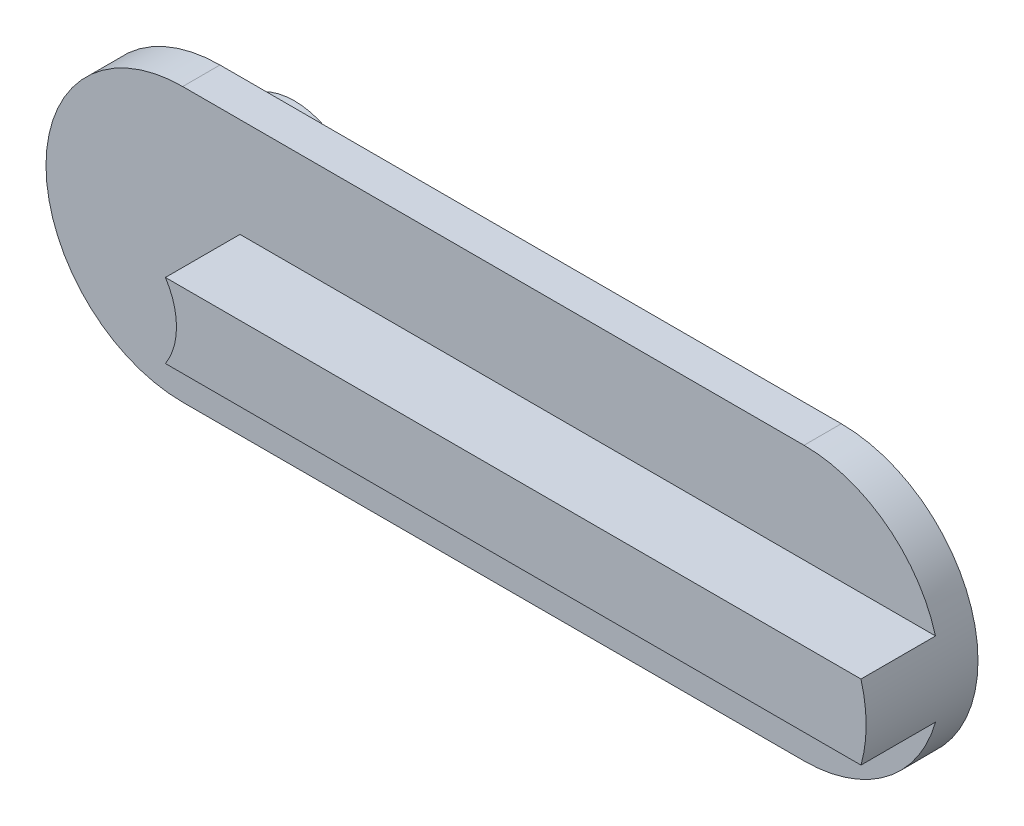
ISO-10303-21;
HEADER;
FILE_DESCRIPTION(('STEP AP214'),'2;1');
FILE_NAME('part.step','',(''),(''),'','','');
FILE_SCHEMA(('AUTOMOTIVE_DESIGN { 1 0 10303 214 1 1 1 1 }'));
ENDSEC;
DATA;
#1=APPLICATION_CONTEXT('core data for automotive mechanical design processes');
#2=APPLICATION_PROTOCOL_DEFINITION('international standard','automotive_design',2000,#1);
#3=PRODUCT_CONTEXT('',#1,'mechanical');
#4=PRODUCT('Part','Part','',(#3));
#5=PRODUCT_RELATED_PRODUCT_CATEGORY('part','',(#4));
#6=PRODUCT_DEFINITION_FORMATION('','',#4);
#7=PRODUCT_DEFINITION_CONTEXT('part definition',#1,'design');
#8=PRODUCT_DEFINITION('design','',#6,#7);
#9=PRODUCT_DEFINITION_SHAPE('','',#8);
#10=(LENGTH_UNIT() NAMED_UNIT(*) SI_UNIT(.MILLI.,.METRE.));
#11=(NAMED_UNIT(*) PLANE_ANGLE_UNIT() SI_UNIT($,.RADIAN.));
#12=(NAMED_UNIT(*) SI_UNIT($,.STERADIAN.) SOLID_ANGLE_UNIT());
#13=UNCERTAINTY_MEASURE_WITH_UNIT(LENGTH_MEASURE(1.E-05),#10,'distance_accuracy_value','');
#14=(GEOMETRIC_REPRESENTATION_CONTEXT(3) GLOBAL_UNCERTAINTY_ASSIGNED_CONTEXT((#13)) GLOBAL_UNIT_ASSIGNED_CONTEXT((#10,
#11,#12)) REPRESENTATION_CONTEXT('',''));
#15=CARTESIAN_POINT('',(0.,0.,0.));
#16=DIRECTION('',(0.,0.,1.));
#17=DIRECTION('',(1.,0.,0.));
#18=AXIS2_PLACEMENT_3D('',#15,#16,#17);
#19=CARTESIAN_POINT('',(-50.,0.,6.));
#20=DIRECTION('',(0.,0.,-1.));
#21=DIRECTION('',(-1.,0.,0.));
#22=AXIS2_PLACEMENT_3D('',#19,#20,#21);
#23=CYLINDRICAL_SURFACE('',#22,22.);
#24=CARTESIAN_POINT('',(-50.,0.,0.));
#25=DIRECTION('',(0.,0.,1.));
#26=DIRECTION('',(1.,0.,0.));
#27=AXIS2_PLACEMENT_3D('',#24,#25,#26);
#28=CIRCLE('',#27,22.);
#29=CARTESIAN_POINT('',(-50.,22.,0.));
#30=VERTEX_POINT('',#29);
#31=CARTESIAN_POINT('',(-50.,-22.,0.));
#32=VERTEX_POINT('',#31);
#33=EDGE_CURVE('E129',#30,#32,#28,.T.);
#34=ORIENTED_EDGE('',*,*,#33,.T.);
#35=DIRECTION('',(0.,0.,-1.));
#36=VECTOR('',#35,1.);
#37=CARTESIAN_POINT('',(-50.,-22.,6.));
#38=LINE('',#37,#36);
#39=CARTESIAN_POINT('',(-50.,-22.,6.));
#40=VERTEX_POINT('',#39);
#41=EDGE_CURVE('E47',#40,#32,#38,.T.);
#42=ORIENTED_EDGE('',*,*,#41,.F.);
#43=CARTESIAN_POINT('',(-50.,0.,6.));
#44=DIRECTION('',(0.,0.,1.));
#45=DIRECTION('',(1.,0.,0.));
#46=AXIS2_PLACEMENT_3D('',#43,#44,#45);
#47=CIRCLE('',#46,22.);
#48=CARTESIAN_POINT('',(-50.,22.,6.));
#49=VERTEX_POINT('',#48);
#50=EDGE_CURVE('E140',#49,#40,#47,.T.);
#51=ORIENTED_EDGE('',*,*,#50,.F.);
#52=DIRECTION('',(0.,0.,-1.));
#53=VECTOR('',#52,1.);
#54=CARTESIAN_POINT('',(-50.,22.,6.));
#55=LINE('',#54,#53);
#56=EDGE_CURVE('E153',#49,#30,#55,.T.);
#57=ORIENTED_EDGE('',*,*,#56,.T.);
#58=EDGE_LOOP('',(#34,#42,#51,#57));
#59=FACE_BOUND('',#58,.T.);
#60=ADVANCED_FACE('F39',(#59),#23,.T.);
#61=CARTESIAN_POINT('',(-50.,-22.,6.));
#62=DIRECTION('',(0.,1.,0.));
#63=DIRECTION('',(0.,0.,1.));
#64=AXIS2_PLACEMENT_3D('',#61,#62,#63);
#65=PLANE('',#64);
#66=DIRECTION('',(1.,0.,0.));
#67=VECTOR('',#66,1.);
#68=CARTESIAN_POINT('',(-50.,-22.,0.));
#69=LINE('',#68,#67);
#70=CARTESIAN_POINT('',(50.,-22.,0.));
#71=VERTEX_POINT('',#70);
#72=EDGE_CURVE('E134',#32,#71,#69,.T.);
#73=ORIENTED_EDGE('',*,*,#72,.T.);
#74=DIRECTION('',(0.,0.,-1.));
#75=VECTOR('',#74,1.);
#76=CARTESIAN_POINT('',(50.,-22.,6.));
#77=LINE('',#76,#75);
#78=CARTESIAN_POINT('',(50.,-22.,6.));
#79=VERTEX_POINT('',#78);
#80=EDGE_CURVE('E169',#79,#71,#77,.T.);
#81=ORIENTED_EDGE('',*,*,#80,.F.);
#82=DIRECTION('',(1.,0.,0.));
#83=VECTOR('',#82,1.);
#84=CARTESIAN_POINT('',(-50.,-22.,6.));
#85=LINE('',#84,#83);
#86=EDGE_CURVE('E144',#40,#79,#85,.T.);
#87=ORIENTED_EDGE('',*,*,#86,.F.);
#88=ORIENTED_EDGE('',*,*,#41,.T.);
#89=EDGE_LOOP('',(#73,#81,#87,#88));
#90=FACE_BOUND('',#89,.T.);
#91=ADVANCED_FACE('F176',(#90),#65,.F.);
#92=CARTESIAN_POINT('',(50.,0.,6.));
#93=DIRECTION('',(0.,0.,-1.));
#94=DIRECTION('',(-1.,0.,0.));
#95=AXIS2_PLACEMENT_3D('',#92,#93,#94);
#96=CYLINDRICAL_SURFACE('',#95,22.);
#97=CARTESIAN_POINT('',(50.,0.,0.));
#98=DIRECTION('',(0.,0.,1.));
#99=DIRECTION('',(1.,0.,0.));
#100=AXIS2_PLACEMENT_3D('',#97,#98,#99);
#101=CIRCLE('',#100,22.);
#102=CARTESIAN_POINT('',(50.,22.,0.));
#103=VERTEX_POINT('',#102);
#104=EDGE_CURVE('E157',#71,#103,#101,.T.);
#105=ORIENTED_EDGE('',*,*,#104,.T.);
#106=DIRECTION('',(0.,0.,-1.));
#107=VECTOR('',#106,1.);
#108=CARTESIAN_POINT('',(50.,22.,6.));
#109=LINE('',#108,#107);
#110=CARTESIAN_POINT('',(50.,22.,6.));
#111=VERTEX_POINT('',#110);
#112=EDGE_CURVE('E165',#111,#103,#109,.T.);
#113=ORIENTED_EDGE('',*,*,#112,.F.);
#114=CARTESIAN_POINT('',(50.,0.,6.));
#115=DIRECTION('',(0.,0.,1.));
#116=DIRECTION('',(1.,0.,0.));
#117=AXIS2_PLACEMENT_3D('',#114,#115,#116);
#118=CIRCLE('',#117,22.);
#119=CARTESIAN_POINT('',(71.1660104885167,6.,6.));
#120=VERTEX_POINT('',#119);
#121=EDGE_CURVE('E127',#120,#111,#118,.T.);
#122=ORIENTED_EDGE('',*,*,#121,.F.);
#123=DIRECTION('',(0.,0.,-1.));
#124=VECTOR('',#123,1.);
#125=CARTESIAN_POINT('',(71.1660104885167,6.,18.));
#126=LINE('',#125,#124);
#127=CARTESIAN_POINT('',(71.1660104885167,6.,18.));
#128=VERTEX_POINT('',#127);
#129=EDGE_CURVE('E107',#128,#120,#126,.T.);
#130=ORIENTED_EDGE('',*,*,#129,.F.);
#131=CARTESIAN_POINT('',(50.,0.,18.));
#132=DIRECTION('',(0.,0.,1.));
#133=DIRECTION('',(1.,0.,0.));
#134=AXIS2_PLACEMENT_3D('',#131,#132,#133);
#135=CIRCLE('',#134,22.);
#136=CARTESIAN_POINT('',(71.1660104885167,-6.00000000000002,18.));
#137=VERTEX_POINT('',#136);
#138=EDGE_CURVE('E114',#137,#128,#135,.T.);
#139=ORIENTED_EDGE('',*,*,#138,.F.);
#140=DIRECTION('',(0.,0.,-1.));
#141=VECTOR('',#140,1.);
#142=CARTESIAN_POINT('',(71.1660104885167,-6.00000000000002,18.));
#143=LINE('',#142,#141);
#144=CARTESIAN_POINT('',(71.1660104885167,-6.00000000000002,6.));
#145=VERTEX_POINT('',#144);
#146=EDGE_CURVE('E192',#137,#145,#143,.T.);
#147=ORIENTED_EDGE('',*,*,#146,.T.);
#148=EDGE_CURVE('E148',#79,#145,#118,.T.);
#149=ORIENTED_EDGE('',*,*,#148,.F.);
#150=ORIENTED_EDGE('',*,*,#80,.T.);
#151=EDGE_LOOP('',(#105,#113,#122,#130,#139,#147,#149,#150));
#152=FACE_BOUND('',#151,.T.);
#153=ADVANCED_FACE('F125',(#152),#96,.T.);
#154=CARTESIAN_POINT('',(-50.,22.,6.));
#155=DIRECTION('',(0.,-1.,0.));
#156=DIRECTION('',(0.,0.,-1.));
#157=AXIS2_PLACEMENT_3D('',#154,#155,#156);
#158=PLANE('',#157);
#159=DIRECTION('',(-1.,0.,0.));
#160=VECTOR('',#159,1.);
#161=CARTESIAN_POINT('',(-50.,22.,0.));
#162=LINE('',#161,#160);
#163=EDGE_CURVE('E145',#103,#30,#162,.T.);
#164=ORIENTED_EDGE('',*,*,#163,.T.);
#165=ORIENTED_EDGE('',*,*,#56,.F.);
#166=DIRECTION('',(-1.,0.,0.));
#167=VECTOR('',#166,1.);
#168=CARTESIAN_POINT('',(-50.,22.,6.));
#169=LINE('',#168,#167);
#170=EDGE_CURVE('E151',#111,#49,#169,.T.);
#171=ORIENTED_EDGE('',*,*,#170,.F.);
#172=ORIENTED_EDGE('',*,*,#112,.T.);
#173=EDGE_LOOP('',(#164,#165,#171,#172));
#174=FACE_BOUND('',#173,.T.);
#175=ADVANCED_FACE('F189',(#174),#158,.F.);
#176=CARTESIAN_POINT('',(-50.,0.,6.));
#177=DIRECTION('',(0.,0.,1.));
#178=DIRECTION('',(1.,0.,0.));
#179=AXIS2_PLACEMENT_3D('',#176,#177,#178);
#180=PLANE('',#179);
#181=DIRECTION('',(1.,0.,0.));
#182=VECTOR('',#181,1.);
#183=CARTESIAN_POINT('',(-40.7804555427071,-6.00000000000002,6.));
#184=LINE('',#183,#182);
#185=CARTESIAN_POINT('',(-40.7804555427071,-6.00000000000002,6.));
#186=VERTEX_POINT('',#185);
#187=EDGE_CURVE('E54',#186,#145,#184,.T.);
#188=ORIENTED_EDGE('',*,*,#187,.F.);
#189=CARTESIAN_POINT('',(-50.,0.,6.));
#190=DIRECTION('',(0.,0.,-1.));
#191=DIRECTION('',(1.,0.,0.));
#192=AXIS2_PLACEMENT_3D('',#189,#190,#191);
#193=CIRCLE('',#192,11.);
#194=CARTESIAN_POINT('',(-40.7804555427071,6.,6.));
#195=VERTEX_POINT('',#194);
#196=EDGE_CURVE('E203',#195,#186,#193,.T.);
#197=ORIENTED_EDGE('',*,*,#196,.F.);
#198=DIRECTION('',(-1.,0.,0.));
#199=VECTOR('',#198,1.);
#200=CARTESIAN_POINT('',(-40.7804555427071,6.,6.));
#201=LINE('',#200,#199);
#202=EDGE_CURVE('E60',#120,#195,#201,.T.);
#203=ORIENTED_EDGE('',*,*,#202,.F.);
#204=ORIENTED_EDGE('',*,*,#121,.T.);
#205=ORIENTED_EDGE('',*,*,#170,.T.);
#206=ORIENTED_EDGE('',*,*,#50,.T.);
#207=ORIENTED_EDGE('',*,*,#86,.T.);
#208=ORIENTED_EDGE('',*,*,#148,.T.);
#209=EDGE_LOOP('',(#188,#197,#203,#204,#205,#206,#207,#208));
#210=FACE_BOUND('',#209,.T.);
#211=ADVANCED_FACE('F190',(#210),#180,.T.);
#212=CARTESIAN_POINT('',(-50.,0.,0.));
#213=DIRECTION('',(0.,0.,1.));
#214=DIRECTION('',(1.,0.,0.));
#215=AXIS2_PLACEMENT_3D('',#212,#213,#214);
#216=PLANE('',#215);
#217=CARTESIAN_POINT('',(-50.,0.,0.));
#218=DIRECTION('',(0.,0.,1.));
#219=DIRECTION('',(1.,0.,0.));
#220=AXIS2_PLACEMENT_3D('',#217,#218,#219);
#221=CIRCLE('',#220,11.);
#222=CARTESIAN_POINT('',(-39.,0.,0.));
#223=VERTEX_POINT('',#222);
#224=EDGE_CURVE('E11',#223,#223,#221,.F.);
#225=ORIENTED_EDGE('',*,*,#224,.F.);
#226=EDGE_LOOP('',(#225));
#227=FACE_BOUND('',#226,.T.);
#228=ORIENTED_EDGE('',*,*,#33,.F.);
#229=ORIENTED_EDGE('',*,*,#163,.F.);
#230=ORIENTED_EDGE('',*,*,#104,.F.);
#231=ORIENTED_EDGE('',*,*,#72,.F.);
#232=EDGE_LOOP('',(#228,#229,#230,#231));
#233=FACE_BOUND('',#232,.T.);
#234=ADVANCED_FACE('F184',(#227,#233),#216,.F.);
#235=CARTESIAN_POINT('',(-40.7804555427071,6.,18.));
#236=DIRECTION('',(0.,-1.,0.));
#237=DIRECTION('',(1.,0.,0.));
#238=AXIS2_PLACEMENT_3D('',#235,#236,#237);
#239=PLANE('',#238);
#240=ORIENTED_EDGE('',*,*,#202,.T.);
#241=DIRECTION('',(0.,0.,-1.));
#242=VECTOR('',#241,1.);
#243=CARTESIAN_POINT('',(-40.7804555427071,6.,18.));
#244=LINE('',#243,#242);
#245=CARTESIAN_POINT('',(-40.7804555427071,6.,18.));
#246=VERTEX_POINT('',#245);
#247=EDGE_CURVE('E109',#246,#195,#244,.T.);
#248=ORIENTED_EDGE('',*,*,#247,.F.);
#249=DIRECTION('',(-1.,0.,0.));
#250=VECTOR('',#249,1.);
#251=CARTESIAN_POINT('',(-40.7804555427071,6.,18.));
#252=LINE('',#251,#250);
#253=EDGE_CURVE('E103',#128,#246,#252,.T.);
#254=ORIENTED_EDGE('',*,*,#253,.F.);
#255=ORIENTED_EDGE('',*,*,#129,.T.);
#256=EDGE_LOOP('',(#240,#248,#254,#255));
#257=FACE_BOUND('',#256,.T.);
#258=ADVANCED_FACE('F105',(#257),#239,.F.);
#259=CARTESIAN_POINT('',(-50.,0.,18.));
#260=DIRECTION('',(0.,0.,-1.));
#261=DIRECTION('',(-1.,0.,0.));
#262=AXIS2_PLACEMENT_3D('',#259,#260,#261);
#263=CYLINDRICAL_SURFACE('',#262,11.);
#264=ORIENTED_EDGE('',*,*,#196,.T.);
#265=DIRECTION('',(0.,0.,-1.));
#266=VECTOR('',#265,1.);
#267=CARTESIAN_POINT('',(-40.7804555427071,-6.00000000000002,18.));
#268=LINE('',#267,#266);
#269=CARTESIAN_POINT('',(-40.7804555427071,-6.00000000000002,18.));
#270=VERTEX_POINT('',#269);
#271=EDGE_CURVE('E136',#270,#186,#268,.T.);
#272=ORIENTED_EDGE('',*,*,#271,.F.);
#273=CARTESIAN_POINT('',(-50.,0.,18.));
#274=DIRECTION('',(0.,0.,-1.));
#275=DIRECTION('',(1.,0.,0.));
#276=AXIS2_PLACEMENT_3D('',#273,#274,#275);
#277=CIRCLE('',#276,11.);
#278=EDGE_CURVE('E113',#246,#270,#277,.T.);
#279=ORIENTED_EDGE('',*,*,#278,.F.);
#280=ORIENTED_EDGE('',*,*,#247,.T.);
#281=EDGE_LOOP('',(#264,#272,#279,#280));
#282=FACE_BOUND('',#281,.T.);
#283=ADVANCED_FACE('F229',(#282),#263,.F.);
#284=CARTESIAN_POINT('',(-40.7804555427071,-6.00000000000002,18.));
#285=DIRECTION('',(0.,1.,0.));
#286=DIRECTION('',(-1.,0.,0.));
#287=AXIS2_PLACEMENT_3D('',#284,#285,#286);
#288=PLANE('',#287);
#289=ORIENTED_EDGE('',*,*,#187,.T.);
#290=ORIENTED_EDGE('',*,*,#146,.F.);
#291=DIRECTION('',(1.,0.,0.));
#292=VECTOR('',#291,1.);
#293=CARTESIAN_POINT('',(-40.7804555427071,-6.00000000000002,18.));
#294=LINE('',#293,#292);
#295=EDGE_CURVE('E119',#270,#137,#294,.T.);
#296=ORIENTED_EDGE('',*,*,#295,.F.);
#297=ORIENTED_EDGE('',*,*,#271,.T.);
#298=EDGE_LOOP('',(#289,#290,#296,#297));
#299=FACE_BOUND('',#298,.T.);
#300=ADVANCED_FACE('F268',(#299),#288,.F.);
#301=CARTESIAN_POINT('',(50.,0.,18.));
#302=DIRECTION('',(0.,0.,1.));
#303=DIRECTION('',(1.,0.,0.));
#304=AXIS2_PLACEMENT_3D('',#301,#302,#303);
#305=PLANE('',#304);
#306=ORIENTED_EDGE('',*,*,#138,.T.);
#307=ORIENTED_EDGE('',*,*,#253,.T.);
#308=ORIENTED_EDGE('',*,*,#278,.T.);
#309=ORIENTED_EDGE('',*,*,#295,.T.);
#310=EDGE_LOOP('',(#306,#307,#308,#309));
#311=FACE_BOUND('',#310,.T.);
#312=ADVANCED_FACE('F117',(#311),#305,.T.);
#313=CARTESIAN_POINT('',(-50.,0.,-12.));
#314=DIRECTION('',(0.,0.,1.));
#315=DIRECTION('',(1.,0.,0.));
#316=AXIS2_PLACEMENT_3D('',#313,#314,#315);
#317=CYLINDRICAL_SURFACE('',#316,11.);
#318=CARTESIAN_POINT('',(-50.,0.,-12.));
#319=DIRECTION('',(0.,0.,-1.));
#320=DIRECTION('',(-1.,0.,0.));
#321=AXIS2_PLACEMENT_3D('',#318,#319,#320);
#322=CIRCLE('',#321,11.);
#323=CARTESIAN_POINT('',(-61.,0.,-12.));
#324=VERTEX_POINT('',#323);
#325=EDGE_CURVE('E207',#324,#324,#322,.T.);
#326=ORIENTED_EDGE('',*,*,#325,.F.);
#327=EDGE_LOOP('',(#326));
#328=FACE_BOUND('',#327,.T.);
#329=ORIENTED_EDGE('',*,*,#224,.T.);
#330=EDGE_LOOP('',(#329));
#331=FACE_BOUND('',#330,.T.);
#332=ADVANCED_FACE('F217',(#328,#331),#317,.T.);
#333=CARTESIAN_POINT('',(-50.,0.,-12.));
#334=DIRECTION('',(0.,0.,-1.));
#335=DIRECTION('',(-1.,0.,0.));
#336=AXIS2_PLACEMENT_3D('',#333,#334,#335);
#337=PLANE('',#336);
#338=ORIENTED_EDGE('',*,*,#325,.T.);
#339=EDGE_LOOP('',(#338));
#340=FACE_BOUND('',#339,.T.);
#341=ADVANCED_FACE('F215',(#340),#337,.T.);
#342=CLOSED_SHELL('',(#60,#91,#153,#175,#211,#234,#258,#283,#300,#312,#332,#341));
#343=MANIFOLD_SOLID_BREP('B2',#342);
#344=ADVANCED_BREP_SHAPE_REPRESENTATION('',(#18,#343),#14);
#345=SHAPE_DEFINITION_REPRESENTATION(#9,#344);
ENDSEC;
END-ISO-10303-21;
